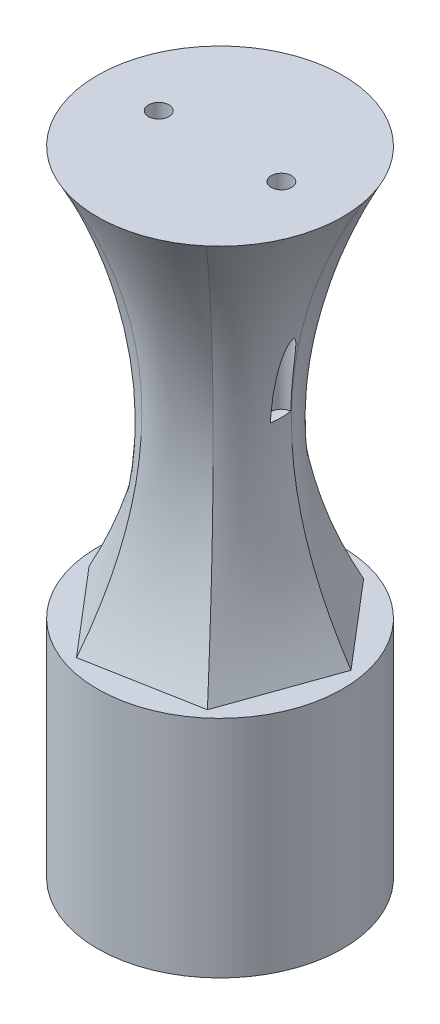
ISO-10303-21;
HEADER;
FILE_DESCRIPTION(('STEP AP214'),'2;1');
FILE_NAME('part.step','',(''),(''),'','','');
FILE_SCHEMA(('AUTOMOTIVE_DESIGN { 1 0 10303 214 1 1 1 1 }'));
ENDSEC;
DATA;
#1=APPLICATION_CONTEXT('core data for automotive mechanical design processes');
#2=APPLICATION_PROTOCOL_DEFINITION('international standard','automotive_design',2000,#1);
#3=PRODUCT_CONTEXT('',#1,'mechanical');
#4=PRODUCT('Part','Part','',(#3));
#5=PRODUCT_RELATED_PRODUCT_CATEGORY('part','',(#4));
#6=PRODUCT_DEFINITION_FORMATION('','',#4);
#7=PRODUCT_DEFINITION_CONTEXT('part definition',#1,'design');
#8=PRODUCT_DEFINITION('design','',#6,#7);
#9=PRODUCT_DEFINITION_SHAPE('','',#8);
#10=(LENGTH_UNIT() NAMED_UNIT(*) SI_UNIT(.MILLI.,.METRE.));
#11=(NAMED_UNIT(*) PLANE_ANGLE_UNIT() SI_UNIT($,.RADIAN.));
#12=(NAMED_UNIT(*) SI_UNIT($,.STERADIAN.) SOLID_ANGLE_UNIT());
#13=UNCERTAINTY_MEASURE_WITH_UNIT(LENGTH_MEASURE(1.E-05),#10,'distance_accuracy_value','');
#14=(GEOMETRIC_REPRESENTATION_CONTEXT(3) GLOBAL_UNCERTAINTY_ASSIGNED_CONTEXT((#13)) GLOBAL_UNIT_ASSIGNED_CONTEXT((#10,
#11,#12)) REPRESENTATION_CONTEXT('',''));
#15=CARTESIAN_POINT('',(0.,0.,0.));
#16=DIRECTION('',(0.,0.,1.));
#17=DIRECTION('',(1.,0.,0.));
#18=AXIS2_PLACEMENT_3D('',#15,#16,#17);
#19=CARTESIAN_POINT('',(0.,11.,0.));
#20=DIRECTION('',(0.,1.,0.));
#21=DIRECTION('',(0.,0.,1.));
#22=AXIS2_PLACEMENT_3D('',#19,#20,#21);
#23=PLANE('',#22);
#24=CARTESIAN_POINT('',(0.,11.,0.));
#25=DIRECTION('',(0.,1.,0.));
#26=DIRECTION('',(0.,0.,1.));
#27=AXIS2_PLACEMENT_3D('',#24,#25,#26);
#28=CIRCLE('',#27,6.);
#29=CARTESIAN_POINT('',(0.,11.,6.));
#30=VERTEX_POINT('',#29);
#31=EDGE_CURVE('E149',#30,#30,#28,.T.);
#32=ORIENTED_EDGE('',*,*,#31,.T.);
#33=EDGE_LOOP('',(#32));
#34=FACE_BOUND('',#33,.T.);
#35=DIRECTION('',(0.983408971364955,0.,-0.181402301636231));
#36=VECTOR('',#35,1.);
#37=CARTESIAN_POINT('',(-1.84033016288293,11.,5.18297066281329));
#38=LINE('',#37,#36);
#39=CARTESIAN_POINT('',(-1.84033016288293,11.,5.18297066281329));
#40=VERTEX_POINT('',#39);
#41=CARTESIAN_POINT('',(3.56841917962431,11.,4.18525800381402));
#42=VERTEX_POINT('',#41);
#43=EDGE_CURVE('E351',#40,#42,#38,.T.);
#44=ORIENTED_EDGE('',*,*,#43,.F.);
#45=DIRECTION('',(0.648803487204421,0.,0.760956000693459));
#46=VECTOR('',#45,1.);
#47=CARTESIAN_POINT('',(-5.40874934250725,11.,0.997712658999271));
#48=LINE('',#47,#46);
#49=CARTESIAN_POINT('',(-5.40874934250725,11.,0.997712658999271));
#50=VERTEX_POINT('',#49);
#51=EDGE_CURVE('E349',#50,#40,#48,.T.);
#52=ORIENTED_EDGE('',*,*,#51,.F.);
#53=DIRECTION('',(-0.334605484160533,0.,0.94235830232969));
#54=VECTOR('',#53,1.);
#55=CARTESIAN_POINT('',(-3.56841917962431,11.,-4.18525800381402));
#56=LINE('',#55,#54);
#57=CARTESIAN_POINT('',(-3.56841917962431,11.,-4.18525800381402));
#58=VERTEX_POINT('',#57);
#59=EDGE_CURVE('E298',#58,#50,#56,.T.);
#60=ORIENTED_EDGE('',*,*,#59,.F.);
#61=DIRECTION('',(-0.983408971364955,0.,0.181402301636231));
#62=VECTOR('',#61,1.);
#63=CARTESIAN_POINT('',(1.84033016288293,11.,-5.18297066281329));
#64=LINE('',#63,#62);
#65=CARTESIAN_POINT('',(1.84033016288293,11.,-5.18297066281329));
#66=VERTEX_POINT('',#65);
#67=EDGE_CURVE('E365',#66,#58,#64,.T.);
#68=ORIENTED_EDGE('',*,*,#67,.F.);
#69=DIRECTION('',(-0.648803487204421,0.,-0.760956000693459));
#70=VECTOR('',#69,1.);
#71=CARTESIAN_POINT('',(5.40874934250725,11.,-0.997712658999272));
#72=LINE('',#71,#70);
#73=CARTESIAN_POINT('',(5.40874934250725,11.,-0.997712658999272));
#74=VERTEX_POINT('',#73);
#75=EDGE_CURVE('E369',#74,#66,#72,.T.);
#76=ORIENTED_EDGE('',*,*,#75,.F.);
#77=DIRECTION('',(0.334605484160533,0.,-0.94235830232969));
#78=VECTOR('',#77,1.);
#79=CARTESIAN_POINT('',(3.56841917962431,11.,4.18525800381402));
#80=LINE('',#79,#78);
#81=EDGE_CURVE('E355',#42,#74,#80,.T.);
#82=ORIENTED_EDGE('',*,*,#81,.F.);
#83=EDGE_LOOP('',(#44,#52,#60,#68,#76,#82));
#84=FACE_BOUND('',#83,.T.);
#85=ADVANCED_FACE('F76',(#34,#84),#23,.T.);
#86=CARTESIAN_POINT('',(0.,11.,0.));
#87=DIRECTION('',(0.,-1.,0.));
#88=DIRECTION('',(0.,0.,-1.));
#89=AXIS2_PLACEMENT_3D('',#86,#87,#88);
#90=CYLINDRICAL_SURFACE('',#89,6.);
#91=ORIENTED_EDGE('',*,*,#31,.F.);
#92=EDGE_LOOP('',(#91));
#93=FACE_BOUND('',#92,.T.);
#94=CARTESIAN_POINT('',(0.,0.,0.));
#95=DIRECTION('',(0.,1.,0.));
#96=DIRECTION('',(0.,0.,1.));
#97=AXIS2_PLACEMENT_3D('',#94,#95,#96);
#98=CIRCLE('',#97,6.);
#99=CARTESIAN_POINT('',(0.,0.,6.));
#100=VERTEX_POINT('',#99);
#101=EDGE_CURVE('E359',#100,#100,#98,.T.);
#102=ORIENTED_EDGE('',*,*,#101,.T.);
#103=EDGE_LOOP('',(#102));
#104=FACE_BOUND('',#103,.T.);
#105=ADVANCED_FACE('F78',(#93,#104),#90,.T.);
#106=CARTESIAN_POINT('',(0.,0.,0.));
#107=DIRECTION('',(0.,1.,0.));
#108=DIRECTION('',(0.,0.,1.));
#109=AXIS2_PLACEMENT_3D('',#106,#107,#108);
#110=PLANE('',#109);
#111=CARTESIAN_POINT('',(0.,0.,0.));
#112=DIRECTION('',(0.,-1.,0.));
#113=DIRECTION('',(0.,0.,-1.));
#114=AXIS2_PLACEMENT_3D('',#111,#112,#113);
#115=CIRCLE('',#114,3.25);
#116=CARTESIAN_POINT('',(0.,0.,-3.25));
#117=VERTEX_POINT('',#116);
#118=EDGE_CURVE('E462',#117,#117,#115,.T.);
#119=ORIENTED_EDGE('',*,*,#118,.F.);
#120=EDGE_LOOP('',(#119));
#121=FACE_BOUND('',#120,.T.);
#122=ORIENTED_EDGE('',*,*,#101,.F.);
#123=EDGE_LOOP('',(#122));
#124=FACE_BOUND('',#123,.T.);
#125=ADVANCED_FACE('F477',(#121,#124),#110,.F.);
#126=CARTESIAN_POINT('',(0.,10.,0.));
#127=DIRECTION('',(0.,-1.,0.));
#128=DIRECTION('',(0.,0.,-1.));
#129=AXIS2_PLACEMENT_3D('',#126,#127,#128);
#130=CYLINDRICAL_SURFACE('',#129,3.25);
#131=CARTESIAN_POINT('',(0.,10.,0.));
#132=DIRECTION('',(0.,-1.,0.));
#133=DIRECTION('',(0.,0.,-1.));
#134=AXIS2_PLACEMENT_3D('',#131,#132,#133);
#135=CIRCLE('',#134,3.25);
#136=CARTESIAN_POINT('',(0.,10.,-3.25));
#137=VERTEX_POINT('',#136);
#138=EDGE_CURVE('E464',#137,#137,#135,.T.);
#139=ORIENTED_EDGE('',*,*,#138,.F.);
#140=EDGE_LOOP('',(#139));
#141=FACE_BOUND('',#140,.T.);
#142=ORIENTED_EDGE('',*,*,#118,.T.);
#143=EDGE_LOOP('',(#142));
#144=FACE_BOUND('',#143,.T.);
#145=ADVANCED_FACE('F479',(#141,#144),#130,.F.);
#146=CARTESIAN_POINT('',(0.,10.,0.));
#147=DIRECTION('',(0.,-1.,0.));
#148=DIRECTION('',(0.,0.,-1.));
#149=AXIS2_PLACEMENT_3D('',#146,#147,#148);
#150=PLANE('',#149);
#151=ORIENTED_EDGE('',*,*,#138,.T.);
#152=EDGE_LOOP('',(#151));
#153=FACE_BOUND('',#152,.T.);
#154=ADVANCED_FACE('F437',(#153),#150,.T.);
#155=CARTESIAN_POINT('',(0.,31.,0.));
#156=DIRECTION('',(0.,1.,0.));
#157=DIRECTION('',(0.,0.,1.));
#158=AXIS2_PLACEMENT_3D('',#155,#156,#157);
#159=PLANE('',#158);
#160=CARTESIAN_POINT('',(-3.,31.,0.));
#161=DIRECTION('',(0.,1.,0.));
#162=DIRECTION('',(0.,0.,1.));
#163=AXIS2_PLACEMENT_3D('',#160,#161,#162);
#164=CIRCLE('',#163,0.5);
#165=CARTESIAN_POINT('',(-3.,31.,0.499999999999999));
#166=VERTEX_POINT('',#165);
#167=EDGE_CURVE('E346',#166,#166,#164,.T.);
#168=ORIENTED_EDGE('',*,*,#167,.F.);
#169=EDGE_LOOP('',(#168));
#170=FACE_BOUND('',#169,.T.);
#171=CARTESIAN_POINT('',(3.,31.,0.));
#172=DIRECTION('',(0.,1.,0.));
#173=DIRECTION('',(0.,0.,1.));
#174=AXIS2_PLACEMENT_3D('',#171,#172,#173);
#175=CIRCLE('',#174,0.5);
#176=CARTESIAN_POINT('',(3.,31.,0.499999999999998));
#177=VERTEX_POINT('',#176);
#178=EDGE_CURVE('E154',#177,#177,#175,.T.);
#179=ORIENTED_EDGE('',*,*,#178,.F.);
#180=EDGE_LOOP('',(#179));
#181=FACE_BOUND('',#180,.T.);
#182=CARTESIAN_POINT('',(0.,31.,0.));
#183=DIRECTION('',(0.,1.,0.));
#184=DIRECTION('',(0.,0.,1.));
#185=AXIS2_PLACEMENT_3D('',#182,#183,#184);
#186=CIRCLE('',#185,6.);
#187=CARTESIAN_POINT('',(5.90045382818973,31.,-1.08841380981739));
#188=VERTEX_POINT('',#187);
#189=CARTESIAN_POINT('',(2.0076329049632,31.,-5.65414981397814));
#190=VERTEX_POINT('',#189);
#191=EDGE_CURVE('E223',#188,#190,#186,.T.);
#192=ORIENTED_EDGE('',*,*,#191,.T.);
#193=CARTESIAN_POINT('',(-3.89282092322652,31.,-4.56573600416075));
#194=VERTEX_POINT('',#193);
#195=EDGE_CURVE('E390',#190,#194,#186,.T.);
#196=ORIENTED_EDGE('',*,*,#195,.T.);
#197=CARTESIAN_POINT('',(-5.90045382818973,31.,1.08841380981739));
#198=VERTEX_POINT('',#197);
#199=EDGE_CURVE('E386',#194,#198,#186,.T.);
#200=ORIENTED_EDGE('',*,*,#199,.T.);
#201=CARTESIAN_POINT('',(-2.0076329049632,31.,5.65414981397814));
#202=VERTEX_POINT('',#201);
#203=EDGE_CURVE('E272',#198,#202,#186,.T.);
#204=ORIENTED_EDGE('',*,*,#203,.T.);
#205=CARTESIAN_POINT('',(3.89282092322652,31.,4.56573600416075));
#206=VERTEX_POINT('',#205);
#207=EDGE_CURVE('E422',#202,#206,#186,.T.);
#208=ORIENTED_EDGE('',*,*,#207,.T.);
#209=EDGE_CURVE('E285',#206,#188,#186,.T.);
#210=ORIENTED_EDGE('',*,*,#209,.T.);
#211=EDGE_LOOP('',(#192,#196,#200,#204,#208,#210));
#212=FACE_BOUND('',#211,.T.);
#213=ADVANCED_FACE('F195',(#170,#181,#212),#159,.T.);
#214=CARTESIAN_POINT('',(1.84033016288293,11.,-5.18297066281329));
#215=CARTESIAN_POINT('',(1.25496214692231,14.3562356860296,-3.53438318929149));
#216=CARTESIAN_POINT('',(0.697969680686137,21.1121104662841,-1.96571052927938));
#217=CARTESIAN_POINT('',(1.36649730830915,27.6895690193629,-3.84850262340139));
#218=CARTESIAN_POINT('',(2.0076329049632,31.,-5.65414981397814));
#219=CARTESIAN_POINT('',(0.0374137153805157,11.,-4.8503997764802));
#220=CARTESIAN_POINT('',(0.025513246223558,14.3562356860296,-3.30759569108377));
#221=CARTESIAN_POINT('',(-0.0128063931848519,21.1121104662841,-2.39049361333996));
#222=CARTESIAN_POINT('',(-0.0251395648643073,27.6895690193629,-4.68151735437799));
#223=CARTESIAN_POINT('',(-0.0121053467564245,31.,-6.37130325118291));
#224=CARTESIAN_POINT('',(-1.7655027321219,11.,-4.51782889014711));
#225=CARTESIAN_POINT('',(-1.20393565447519,14.3562356860296,-3.08080819287605));
#226=CARTESIAN_POINT('',(-0.840929426599453,21.1121104662841,-2.23773577944418));
#227=CARTESIAN_POINT('',(-1.64681154189777,27.6895690193629,-4.38237931750963));
#228=CARTESIAN_POINT('',(-2.26187870233605,31.,-5.95630392054273));
#229=CARTESIAN_POINT('',(-3.56841917962432,11.,-4.18525800381402));
#230=CARTESIAN_POINT('',(-2.43338455517394,14.3562356860296,-2.85402069466833));
#231=CARTESIAN_POINT('',(-1.35337041449943,21.1121104662841,-1.5873147391852));
#232=CARTESIAN_POINT('',(-2.64965238424208,27.6895690193629,-3.10767269489948));
#233=CARTESIAN_POINT('',(-3.89282092322652,31.,-4.56573600416075));
#234=B_SPLINE_SURFACE_WITH_KNOTS('',3,3,((#214,#215,#216,#217,#218),(#219,#220,#221,#222,#223),
(#224,#225,#226,#227,#228),(#229,#230,#231,#232,#233)),.UNSPECIFIED.,.F.,.F.,.F.,(4,4),(4,1,4),
(0.,1.),(0.,0.494937362252857,1.),.UNSPECIFIED.);
#235=CARTESIAN_POINT('',(-3.56841917962432,11.,-4.18525800381402));
#236=CARTESIAN_POINT('',(-2.43338455517394,14.3562356860296,-2.85402069466833));
#237=CARTESIAN_POINT('',(-1.35337041449943,21.1121104662841,-1.5873147391852));
#238=CARTESIAN_POINT('',(-2.64965238424208,27.6895690193629,-3.10767269489948));
#239=CARTESIAN_POINT('',(-3.89282092322652,31.,-4.56573600416075));
#240=B_SPLINE_CURVE_WITH_KNOTS('',3,(#235,#236,#237,#238,#239),.UNSPECIFIED.,.F.,.F.,(4,1,4),
(0.,0.494937362252857,1.),.UNSPECIFIED.);
#241=EDGE_CURVE('E297',#58,#194,#240,.T.);
#242=CARTESIAN_POINT('',(1.84033016288293,11.,-5.18297066281329));
#243=CARTESIAN_POINT('',(1.25496214692231,14.3562356860296,-3.53438318929149));
#244=CARTESIAN_POINT('',(0.697969680686137,21.1121104662841,-1.96571052927938));
#245=CARTESIAN_POINT('',(1.36649730830915,27.6895690193629,-3.84850262340139));
#246=CARTESIAN_POINT('',(2.0076329049632,31.,-5.65414981397814));
#247=B_SPLINE_CURVE_WITH_KNOTS('',3,(#242,#243,#244,#245,#246),.UNSPECIFIED.,.F.,.F.,(4,1,4),
(0.,0.494937362252857,1.),.UNSPECIFIED.);
#248=EDGE_CURVE('E291',#190,#66,#247,.F.);
#249=ORIENTED_EDGE('',*,*,#67,.T.);
#250=ORIENTED_EDGE('',*,*,#241,.T.);
#251=ORIENTED_EDGE('',*,*,#195,.F.);
#252=ORIENTED_EDGE('',*,*,#248,.T.);
#253=EDGE_LOOP('',(#249,#250,#251,#252));
#254=FACE_BOUND('',#253,.T.);
#255=ADVANCED_FACE('F189',(#254),#234,.T.);
#256=CARTESIAN_POINT('',(-3.56841917962431,11.,-4.18525800381402));
#257=CARTESIAN_POINT('',(-2.43338455517394,14.3562356860296,-2.85402069466833));
#258=CARTESIAN_POINT('',(-1.35337041449943,21.1121104662841,-1.5873147391852));
#259=CARTESIAN_POINT('',(-2.64965238424208,27.6895690193629,-3.10767269489948));
#260=CARTESIAN_POINT('',(-3.89282092322652,31.,-4.56573600416075));
#261=CARTESIAN_POINT('',(-4.18186256725196,11.,-2.45760111620959));
#262=CARTESIAN_POINT('',(-2.85170527081471,14.3562356860296,-1.67589296490449));
#263=CARTESIAN_POINT('',(-2.07663139332929,21.1121104662841,-1.18415614484105));
#264=CARTESIAN_POINT('',(-4.06688273958121,27.6895690193629,-2.31898717537642));
#265=CARTESIAN_POINT('',(-5.523763144117,31.,-3.17516808777878));
#266=CARTESIAN_POINT('',(-4.7953059548796,11.,-0.729944228605161));
#267=CARTESIAN_POINT('',(-3.27002598645548,14.3562356860296,-0.497765235140664));
#268=CARTESIAN_POINT('',(-2.35840074525576,21.1121104662841,-0.390601643497081));
#269=CARTESIAN_POINT('',(-4.61865758893173,27.6895690193629,-0.765009028225924));
#270=CARTESIAN_POINT('',(-6.28924985901888,31.,-1.01930754376936));
#271=CARTESIAN_POINT('',(-5.40874934250725,11.,0.997712658999271));
#272=CARTESIAN_POINT('',(-3.68834670209625,14.3562356860296,0.680362494623166));
#273=CARTESIAN_POINT('',(-2.05134009518556,21.1121104662841,0.378395790094181));
#274=CARTESIAN_POINT('',(-4.01614969255124,27.6895690193629,0.740829928501912));
#275=CARTESIAN_POINT('',(-5.90045382818973,31.,1.08841380981739));
#276=B_SPLINE_SURFACE_WITH_KNOTS('',3,3,((#256,#257,#258,#259,#260),(#261,#262,#263,#264,#265),
(#266,#267,#268,#269,#270),(#271,#272,#273,#274,#275)),.UNSPECIFIED.,.F.,.F.,.F.,(4,4),(4,1,4),
(0.,1.),(0.,0.494937362252857,1.),.UNSPECIFIED.);
#277=CARTESIAN_POINT('',(-2.95833464069776,21.0000000000001,0.498260973628036));
#278=CARTESIAN_POINT('',(-2.96044193076234,21.0832923525403,0.498434427180247));
#279=CARTESIAN_POINT('',(-2.96311866222239,21.1665687293552,0.498648257217201));
#280=CARTESIAN_POINT('',(-2.96963046959226,21.3330778352157,0.499087840527117));
#281=CARTESIAN_POINT('',(-2.97346556951439,21.4163105633205,0.499313594047167));
#282=CARTESIAN_POINT('',(-2.98674953235162,21.6661477914544,0.499906014352937));
#283=CARTESIAN_POINT('',(-2.99797141326797,21.8326637721194,0.500186990918346));
#284=CARTESIAN_POINT('',(-3.02080063736665,22.1093241694634,0.499648377404974));
#285=CARTESIAN_POINT('',(-3.03100814305823,22.2195864925019,0.499167249301472));
#286=CARTESIAN_POINT('',(-3.0537495766716,22.4398611561916,0.497234340862723));
#287=CARTESIAN_POINT('',(-3.06628340872082,22.5498735069557,0.495782600521933));
#288=CARTESIAN_POINT('',(-3.09382958433316,22.7695082421097,0.491316091932521));
#289=CARTESIAN_POINT('',(-3.10884074980416,22.8791307866794,0.48830206517526));
#290=CARTESIAN_POINT('',(-3.14154596425992,23.0978642376619,0.479843839829868));
#291=CARTESIAN_POINT('',(-3.15923948025302,23.2069752412888,0.474400123611986));
#292=CARTESIAN_POINT('',(-3.19758685069228,23.4245465309331,0.459770622092599));
#293=CARTESIAN_POINT('',(-3.2182429431027,23.5330062598483,0.45058199809258));
#294=CARTESIAN_POINT('',(-3.25169300134978,23.6947162052038,0.432214067158768));
#295=CARTESIAN_POINT('',(-3.2632589186496,23.7484766837421,0.425323733157928));
#296=CARTESIAN_POINT('',(-3.28725857514664,23.8554891038398,0.409499893941286));
#297=CARTESIAN_POINT('',(-3.29969204993394,23.9087411947668,0.400567009370444));
#298=CARTESIAN_POINT('',(-3.3255183941395,24.0146420615938,0.379889217000368));
#299=CARTESIAN_POINT('',(-3.33891363550034,24.0672889465796,0.368137177066569));
#300=CARTESIAN_POINT('',(-3.35971353115454,24.1451793669366,0.347418710752828));
#301=CARTESIAN_POINT('',(-3.36675556998339,24.1709318267366,0.340008498587682));
#302=CARTESIAN_POINT('',(-3.38107817756378,24.2219509619337,0.323877549787298));
#303=CARTESIAN_POINT('',(-3.3883586425191,24.2472178413168,0.315157377650863));
#304=CARTESIAN_POINT('',(-3.40178089358084,24.2924279618961,0.297773771486304));
#305=CARTESIAN_POINT('',(-3.407884289392,24.3124916485534,0.289398027794564));
#306=CARTESIAN_POINT('',(-3.42024152451668,24.3519708096687,0.271144244820909));
#307=CARTESIAN_POINT('',(-3.42649579233167,24.371383937123,0.261261358814091));
#308=CARTESIAN_POINT('',(-3.43916264345844,24.4093109779721,0.239373776444956));
#309=CARTESIAN_POINT('',(-3.44557622524228,24.4278114147291,0.227345192791134));
#310=CARTESIAN_POINT('',(-3.45511176719966,24.4539044405246,0.207188375567933));
#311=CARTESIAN_POINT('',(-3.45826788335558,24.4623057373787,0.200138584381193));
#312=CARTESIAN_POINT('',(-3.46450810528997,24.4783448432631,0.18519824857424));
#313=CARTESIAN_POINT('',(-3.46759220804592,24.4859826202912,0.177307668741709));
#314=CARTESIAN_POINT('',(-3.47542628483084,24.5044287366178,0.155474125579467));
#315=CARTESIAN_POINT('',(-3.48007676650074,24.5144230333668,0.140721519715236));
#316=CARTESIAN_POINT('',(-3.48631338502039,24.5256555490864,0.116489757658694));
#317=CARTESIAN_POINT('',(-3.48828048615579,24.5287817976468,0.107993120208232));
#318=CARTESIAN_POINT('',(-3.49182489124534,24.5333729861118,0.0904847152946751));
#319=CARTESIAN_POINT('',(-3.49340298294355,24.534841305289,0.0814740351280652));
#320=CARTESIAN_POINT('',(-3.49592976433828,24.5358653058499,0.0642022596597491));
#321=CARTESIAN_POINT('',(-3.4969262851813,24.5356010655896,0.0559586333919809));
#322=CARTESIAN_POINT('',(-3.49849702127319,24.5336258923369,0.0396051756530414));
#323=CARTESIAN_POINT('',(-3.49907084670957,24.5319136270837,0.0314954744077995));
#324=CARTESIAN_POINT('',(-3.50033632269014,24.5239763471103,0.00462834511104902));
#325=CARTESIAN_POINT('',(-3.5000869095636,24.5147862451528,-0.0132916291990151));
#326=CARTESIAN_POINT('',(-3.49830858888631,24.4944653160943,-0.0433802978658819));
#327=CARTESIAN_POINT('',(-3.4969991217201,24.4839105203049,-0.0560098766567922));
#328=CARTESIAN_POINT('',(-3.49374916219537,24.4612020825209,-0.0797024057382475));
#329=CARTESIAN_POINT('',(-3.49180684803495,24.4490438856301,-0.0907606991168029));
#330=CARTESIAN_POINT('',(-3.48671636743051,24.4190873393636,-0.11541583827956));
#331=CARTESIAN_POINT('',(-3.48338771262656,24.4008633000629,-0.128443610354871));
#332=CARTESIAN_POINT('',(-3.47626914306302,24.3633414835742,-0.152730204011054));
#333=CARTESIAN_POINT('',(-3.47247838147312,24.3440417713793,-0.163985688643044));
#334=CARTESIAN_POINT('',(-3.46458651295028,24.3046659855616,-0.185169558739739));
#335=CARTESIAN_POINT('',(-3.46048391490113,24.2845864396581,-0.195090846322683));
#336=CARTESIAN_POINT('',(-3.45209323446627,24.2439800538838,-0.213813723893126));
#337=CARTESIAN_POINT('',(-3.44780532768942,24.2234536462592,-0.222616344109786));
#338=CARTESIAN_POINT('',(-3.4358355630015,24.1664915780291,-0.245604229173913));
#339=CARTESIAN_POINT('',(-3.42802763611605,24.1297065552954,-0.258855844684915));
#340=CARTESIAN_POINT('',(-3.41225202764356,24.0554851229118,-0.283297347383969));
#341=CARTESIAN_POINT('',(-3.40428425313897,24.0180483361749,-0.294485994483131));
#342=CARTESIAN_POINT('',(-3.3803025840465,23.9049405810654,-0.325678532814742));
#343=CARTESIAN_POINT('',(-3.36424072238734,23.8286133053647,-0.34325683685816));
#344=CARTESIAN_POINT('',(-3.33249848441551,23.6749480970671,-0.374067676368896));
#345=CARTESIAN_POINT('',(-3.31681864488351,23.5976089534212,-0.387294390584951));
#346=CARTESIAN_POINT('',(-3.28611372388421,23.4424229010396,-0.410497913118984));
#347=CARTESIAN_POINT('',(-3.27108786569006,23.3645767283126,-0.420478673211294));
#348=CARTESIAN_POINT('',(-3.23965380604636,23.1969866259774,-0.439259198876275));
#349=CARTESIAN_POINT('',(-3.2233674550464,23.1071772118709,-0.447669194509276));
#350=CARTESIAN_POINT('',(-3.19192111414714,22.9271599379308,-0.462020534885988));
#351=CARTESIAN_POINT('',(-3.17676127091707,22.8369520278279,-0.467961558635));
#352=CARTESIAN_POINT('',(-3.13305091895208,22.5657473024938,-0.482965986246241));
#353=CARTESIAN_POINT('',(-3.10629506716824,22.3843044087725,-0.489197566929915));
#354=CARTESIAN_POINT('',(-3.05782125304284,22.021014188813,-0.497243442340968));
#355=CARTESIAN_POINT('',(-3.03609435508081,21.8391681686223,-0.499065627179972));
#356=CARTESIAN_POINT('',(-2.99763537370058,21.4750040664707,-0.500365363301612));
#357=CARTESIAN_POINT('',(-2.98090156687172,21.2926861693495,-0.499843724576813));
#358=CARTESIAN_POINT('',(-2.96376971888683,21.0734645258436,-0.49869309143781));
#359=CARTESIAN_POINT('',(-2.96100005584012,21.0367356046543,-0.498482687724506));
#360=CARTESIAN_POINT('',(-2.9583302958896,21.,-0.498260610282766));
#361=B_SPLINE_CURVE_WITH_KNOTS('',3,(#277,#278,#279,#280,#281,#282,#283,#284,#285,#286,#287,
#288,#289,#290,#291,#292,#293,#294,#295,#296,#297,#298,#299,#300,#301,#302,#303,#304,#305,#306,
#307,#308,#309,#310,#311,#312,#313,#314,#315,#316,#317,#318,#319,#320,#321,#322,#323,#324,#325,
#326,#327,#328,#329,#330,#331,#332,#333,#334,#335,#336,#337,#338,#339,#340,#341,#342,#343,#344,
#345,#346,#347,#348,#349,#350,#351,#352,#353,#354,#355,#356,#357,#358,#359,#360),.UNSPECIFIED.,
.F.,.F.,(4,2,2,2,2,2,2,2,2,2,2,2,2,2,2,2,2,2,2,2,2,2,2,2,2,2,2,2,2,2,2,2,2,2,2,2,2,2,2,2,2,4),
(0.,0.249952494666007,0.499910171061419,1.00050819881127,1.33268964081271,1.66485739599155,
1.99686764208709,2.3288120029411,2.66100845217354,2.82723427771123,2.99340966119579,
3.16000996694549,3.24310585848642,3.32616604383627,3.39386693587743,3.46179032210736,
3.53052333838362,3.56470898591569,3.59889606570941,3.65340459005576,3.68105968445883,
3.70865830856613,3.73343732656369,3.75823916742394,3.81745091123458,3.86682605235573,
3.91634460643034,3.98413631069999,4.05205416834316,4.12032014579065,4.18852279138868,
4.30804403158049,4.42763688564386,4.66728131304629,4.90724502864249,5.14691549809492,
5.42184602603331,5.69681228692375,6.24715809370363,6.7965183887477,7.34568884718011,
7.45618953981),.UNSPECIFIED.);
#362=CARTESIAN_POINT('',(-2.9583346406965,21.,0.498260973621363));
#363=VERTEX_POINT('',#362);
#364=CARTESIAN_POINT('',(-2.95833029588769,21.,-0.498260610294109));
#365=VERTEX_POINT('',#364);
#366=EDGE_CURVE('E12',#363,#365,#361,.T.);
#367=CARTESIAN_POINT('',(-2.95702037782887,21.,0.505999999999999));
#368=CARTESIAN_POINT('',(-2.9642143457108,21.,0.463975650883925));
#369=CARTESIAN_POINT('',(-2.97051355318742,21.,0.421798067175959));
#370=CARTESIAN_POINT('',(-2.98128173231578,21.,0.337439536219911));
#371=CARTESIAN_POINT('',(-2.98576032613242,21.,0.295259816956572));
#372=CARTESIAN_POINT('',(-2.99291102676122,21.,0.210899306448357));
#373=CARTESIAN_POINT('',(-2.99558953171907,21.,0.168719057640477));
#374=CARTESIAN_POINT('',(-2.99915652936356,21.,0.0843590431197224));
#375=CARTESIAN_POINT('',(-3.00004823683651,21.,0.042179413323957));
#376=CARTESIAN_POINT('',(-3.00004917160005,21.,-0.0421799540587648));
#377=CARTESIAN_POINT('',(-2.99915839526011,21.,-0.0843596916457657));
#378=CARTESIAN_POINT('',(-2.99559306202686,21.,-0.168719885807955));
#379=CARTESIAN_POINT('',(-2.9929152926338,21.,-0.210900206625885));
#380=CARTESIAN_POINT('',(-2.98576530101048,21.,-0.295260815033385));
#381=CARTESIAN_POINT('',(-2.98128667897632,21.,-0.337440560204439));
#382=CARTESIAN_POINT('',(-2.97051581425143,21.,-0.42179890216772));
#383=CARTESIAN_POINT('',(-2.96421392840295,21.,-0.463976267913623));
#384=CARTESIAN_POINT('',(-2.9570150295678,21.,-0.506000000000002));
#385=B_SPLINE_CURVE_WITH_KNOTS('',3,(#367,#368,#369,#370,#371,#372,#373,#374,#375,#376,#377,
#378,#379,#380,#381,#382,#383,#384),.UNSPECIFIED.,.F.,.F.,(4,2,2,2,2,2,2,2,4),(0.,
0.127897401782878,0.255109775974044,0.381867567099285,0.508397091493147,0.634926873599804,
0.761684734837903,0.88889710196445,1.01679498923665),.UNSPECIFIED.);
#386=EDGE_CURVE('E90',#363,#365,#385,.T.);
#387=CARTESIAN_POINT('',(-5.40874934250725,11.,0.997712658999271));
#388=CARTESIAN_POINT('',(-3.68834670209625,14.3562356860296,0.680362494623166));
#389=CARTESIAN_POINT('',(-2.05134009518556,21.1121104662841,0.378395790094181));
#390=CARTESIAN_POINT('',(-4.01614969255124,27.6895690193629,0.740829928501912));
#391=CARTESIAN_POINT('',(-5.90045382818973,31.,1.08841380981739));
#392=B_SPLINE_CURVE_WITH_KNOTS('',3,(#387,#388,#389,#390,#391),.UNSPECIFIED.,.F.,.F.,(4,1,4),
(0.,0.494937362252857,1.),.UNSPECIFIED.);
#393=EDGE_CURVE('E326',#50,#198,#392,.T.);
#394=ORIENTED_EDGE('',*,*,#366,.F.);
#395=ORIENTED_EDGE('',*,*,#386,.T.);
#396=EDGE_LOOP('',(#394,#395));
#397=FACE_BOUND('',#396,.T.);
#398=ORIENTED_EDGE('',*,*,#59,.T.);
#399=ORIENTED_EDGE('',*,*,#393,.T.);
#400=ORIENTED_EDGE('',*,*,#199,.F.);
#401=ORIENTED_EDGE('',*,*,#241,.F.);
#402=EDGE_LOOP('',(#398,#399,#400,#401));
#403=FACE_BOUND('',#402,.T.);
#404=ADVANCED_FACE('F194',(#397,#403),#276,.T.);
#405=CARTESIAN_POINT('',(5.40874934250725,11.,-0.997712658999272));
#406=CARTESIAN_POINT('',(3.68834670209625,14.3562356860296,-0.680362494623167));
#407=CARTESIAN_POINT('',(2.05134009518557,21.1121104662841,-0.37839579009418));
#408=CARTESIAN_POINT('',(4.01614969255124,27.6895690193629,-0.74082992850191));
#409=CARTESIAN_POINT('',(5.90045382818973,31.,-1.08841380981739));
#410=CARTESIAN_POINT('',(4.21927628263247,11.,-2.39279866027061));
#411=CARTESIAN_POINT('',(2.87721851703827,14.3562356860296,-1.63170272617927));
#412=CARTESIAN_POINT('',(2.06382500014444,21.1121104662841,-1.20633746849891));
#413=CARTESIAN_POINT('',(4.0417431747169,27.6895690193629,-2.36253017900157));
#414=CARTESIAN_POINT('',(5.51165779736058,31.,-3.19613516340414));
#415=CARTESIAN_POINT('',(3.0298032227577,11.,-3.78788466154195));
#416=CARTESIAN_POINT('',(2.06609033198029,14.3562356860296,-2.58304295773538));
#417=CARTESIAN_POINT('',(1.51747131865631,21.1121104662841,-1.8471341359471));
#418=CARTESIAN_POINT('',(2.97184604703396,27.6895690193629,-3.61737028928371));
#419=CARTESIAN_POINT('',(4.02737115668283,31.,-4.93699637677337));
#420=CARTESIAN_POINT('',(1.84033016288293,11.,-5.1829706628133));
#421=CARTESIAN_POINT('',(1.25496214692231,14.3562356860296,-3.53438318929149));
#422=CARTESIAN_POINT('',(0.697969680686138,21.1121104662841,-1.96571052927938));
#423=CARTESIAN_POINT('',(1.36649730830915,27.6895690193629,-3.84850262340139));
#424=CARTESIAN_POINT('',(2.0076329049632,31.,-5.65414981397814));
#425=B_SPLINE_SURFACE_WITH_KNOTS('',3,3,((#405,#406,#407,#408,#409),(#410,#411,#412,#413,#414),
(#415,#416,#417,#418,#419),(#420,#421,#422,#423,#424)),.UNSPECIFIED.,.F.,.F.,.F.,(4,4),(4,1,4),
(0.,1.),(0.,0.494937362252857,1.),.UNSPECIFIED.);
#426=CARTESIAN_POINT('',(5.40874934250725,11.,-0.997712658999272));
#427=CARTESIAN_POINT('',(3.68834670209625,14.3562356860296,-0.680362494623167));
#428=CARTESIAN_POINT('',(2.05134009518557,21.1121104662841,-0.378395790094179));
#429=CARTESIAN_POINT('',(4.01614969255124,27.6895690193629,-0.740829928501909));
#430=CARTESIAN_POINT('',(5.90045382818973,31.,-1.08841380981739));
#431=B_SPLINE_CURVE_WITH_KNOTS('',3,(#426,#427,#428,#429,#430),.UNSPECIFIED.,.F.,.F.,(4,1,4),
(0.,0.494937362252857,1.),.UNSPECIFIED.);
#432=EDGE_CURVE('E303',#74,#188,#431,.T.);
#433=ORIENTED_EDGE('',*,*,#75,.T.);
#434=ORIENTED_EDGE('',*,*,#248,.F.);
#435=ORIENTED_EDGE('',*,*,#191,.F.);
#436=ORIENTED_EDGE('',*,*,#432,.F.);
#437=EDGE_LOOP('',(#433,#434,#435,#436));
#438=FACE_BOUND('',#437,.T.);
#439=ADVANCED_FACE('F230',(#438),#425,.T.);
#440=CARTESIAN_POINT('',(-5.40874934250725,11.,0.997712658999271));
#441=CARTESIAN_POINT('',(-3.68834670209625,14.3562356860296,0.680362494623166));
#442=CARTESIAN_POINT('',(-2.05134009518556,21.1121104662841,0.378395790094181));
#443=CARTESIAN_POINT('',(-4.01614969255124,27.6895690193629,0.740829928501911));
#444=CARTESIAN_POINT('',(-5.90045382818973,31.,1.08841380981739));
#445=CARTESIAN_POINT('',(-4.21927628263248,11.,2.39279866027061));
#446=CARTESIAN_POINT('',(-2.87721851703827,14.3562356860296,1.63170272617927));
#447=CARTESIAN_POINT('',(-2.06382500014443,21.1121104662841,1.20633746849891));
#448=CARTESIAN_POINT('',(-4.0417431747169,27.6895690193629,2.36253017900157));
#449=CARTESIAN_POINT('',(-5.51165779736058,31.,3.19613516340414));
#450=CARTESIAN_POINT('',(-3.02980322275771,11.,3.78788466154195));
#451=CARTESIAN_POINT('',(-2.06609033198029,14.3562356860296,2.58304295773538));
#452=CARTESIAN_POINT('',(-1.5174713186563,21.1121104662841,1.8471341359471));
#453=CARTESIAN_POINT('',(-2.97184604703396,27.6895690193629,3.6173702892837));
#454=CARTESIAN_POINT('',(-4.02737115668283,31.,4.93699637677336));
#455=CARTESIAN_POINT('',(-1.84033016288293,11.,5.18297066281329));
#456=CARTESIAN_POINT('',(-1.25496214692231,14.3562356860296,3.53438318929149));
#457=CARTESIAN_POINT('',(-0.697969680686139,21.1121104662841,1.96571052927938));
#458=CARTESIAN_POINT('',(-1.36649730830916,27.6895690193629,3.84850262340139));
#459=CARTESIAN_POINT('',(-2.0076329049632,31.,5.65414981397814));
#460=B_SPLINE_SURFACE_WITH_KNOTS('',3,3,((#440,#441,#442,#443,#444),(#445,#446,#447,#448,#449),
(#450,#451,#452,#453,#454),(#455,#456,#457,#458,#459)),.UNSPECIFIED.,.F.,.F.,.F.,(4,4),(4,1,4),
(0.,1.),(0.,0.494937362252857,1.),.UNSPECIFIED.);
#461=CARTESIAN_POINT('',(-1.84033016288293,11.,5.18297066281329));
#462=CARTESIAN_POINT('',(-1.25496214692231,14.3562356860296,3.53438318929149));
#463=CARTESIAN_POINT('',(-0.697969680686139,21.1121104662841,1.96571052927938));
#464=CARTESIAN_POINT('',(-1.36649730830916,27.6895690193629,3.84850262340139));
#465=CARTESIAN_POINT('',(-2.0076329049632,31.,5.65414981397814));
#466=B_SPLINE_CURVE_WITH_KNOTS('',3,(#461,#462,#463,#464,#465),.UNSPECIFIED.,.F.,.F.,(4,1,4),
(0.,0.494937362252857,1.),.UNSPECIFIED.);
#467=EDGE_CURVE('E317',#40,#202,#466,.T.);
#468=ORIENTED_EDGE('',*,*,#51,.T.);
#469=ORIENTED_EDGE('',*,*,#467,.T.);
#470=ORIENTED_EDGE('',*,*,#203,.F.);
#471=ORIENTED_EDGE('',*,*,#393,.F.);
#472=EDGE_LOOP('',(#468,#469,#470,#471));
#473=FACE_BOUND('',#472,.T.);
#474=ADVANCED_FACE('F241',(#473),#460,.T.);
#475=CARTESIAN_POINT('',(-1.84033016288293,11.,5.18297066281329));
#476=CARTESIAN_POINT('',(-1.25496214692231,14.3562356860296,3.53438318929149));
#477=CARTESIAN_POINT('',(-0.697969680686139,21.1121104662841,1.96571052927938));
#478=CARTESIAN_POINT('',(-1.36649730830915,27.6895690193629,3.84850262340139));
#479=CARTESIAN_POINT('',(-2.0076329049632,31.,5.65414981397814));
#480=CARTESIAN_POINT('',(-0.0374137153805177,11.,4.8503997764802));
#481=CARTESIAN_POINT('',(-0.0255132462235593,14.3562356860296,3.30759569108377));
#482=CARTESIAN_POINT('',(0.0128063931848503,21.1121104662841,2.39049361333996));
#483=CARTESIAN_POINT('',(0.0251395648643049,27.6895690193629,4.68151735437799));
#484=CARTESIAN_POINT('',(0.012105346756421,31.,6.37130325118292));
#485=CARTESIAN_POINT('',(1.7655027321219,11.,4.51782889014711));
#486=CARTESIAN_POINT('',(1.20393565447519,14.3562356860296,3.08080819287605));
#487=CARTESIAN_POINT('',(0.840929426599452,21.1121104662841,2.23773577944418));
#488=CARTESIAN_POINT('',(1.64681154189777,27.6895690193629,4.38237931750963));
#489=CARTESIAN_POINT('',(2.26187870233605,31.,5.95630392054273));
#490=CARTESIAN_POINT('',(3.56841917962432,11.,4.18525800381402));
#491=CARTESIAN_POINT('',(2.43338455517394,14.3562356860296,2.85402069466833));
#492=CARTESIAN_POINT('',(1.35337041449943,21.1121104662841,1.5873147391852));
#493=CARTESIAN_POINT('',(2.64965238424208,27.6895690193629,3.10767269489948));
#494=CARTESIAN_POINT('',(3.89282092322652,31.,4.56573600416075));
#495=B_SPLINE_SURFACE_WITH_KNOTS('',3,3,((#475,#476,#477,#478,#479),(#480,#481,#482,#483,#484),
(#485,#486,#487,#488,#489),(#490,#491,#492,#493,#494)),.UNSPECIFIED.,.F.,.F.,.F.,(4,4),(4,1,4),
(0.,1.),(0.,0.494937362252857,1.),.UNSPECIFIED.);
#496=CARTESIAN_POINT('',(3.56841917962432,11.,4.18525800381402));
#497=CARTESIAN_POINT('',(2.43338455517394,14.3562356860296,2.85402069466833));
#498=CARTESIAN_POINT('',(1.35337041449943,21.1121104662841,1.5873147391852));
#499=CARTESIAN_POINT('',(2.64965238424208,27.6895690193629,3.10767269489948));
#500=CARTESIAN_POINT('',(3.89282092322652,31.,4.56573600416075));
#501=B_SPLINE_CURVE_WITH_KNOTS('',3,(#496,#497,#498,#499,#500),.UNSPECIFIED.,.F.,.F.,(4,1,4),
(0.,0.494937362252857,1.),.UNSPECIFIED.);
#502=EDGE_CURVE('E308',#42,#206,#501,.T.);
#503=ORIENTED_EDGE('',*,*,#43,.T.);
#504=ORIENTED_EDGE('',*,*,#502,.T.);
#505=ORIENTED_EDGE('',*,*,#207,.F.);
#506=ORIENTED_EDGE('',*,*,#467,.F.);
#507=EDGE_LOOP('',(#503,#504,#505,#506));
#508=FACE_BOUND('',#507,.T.);
#509=ADVANCED_FACE('F251',(#508),#495,.T.);
#510=CARTESIAN_POINT('',(3.56841917962431,11.,4.18525800381402));
#511=CARTESIAN_POINT('',(2.43338455517394,14.3562356860296,2.85402069466833));
#512=CARTESIAN_POINT('',(1.35337041449943,21.1121104662841,1.5873147391852));
#513=CARTESIAN_POINT('',(2.64965238424208,27.6895690193629,3.10767269489948));
#514=CARTESIAN_POINT('',(3.89282092322653,31.,4.56573600416075));
#515=CARTESIAN_POINT('',(4.18186256725196,11.,2.45760111620959));
#516=CARTESIAN_POINT('',(2.85170527081471,14.3562356860296,1.67589296490449));
#517=CARTESIAN_POINT('',(2.07663139332929,21.1121104662841,1.18415614484105));
#518=CARTESIAN_POINT('',(4.06688273958121,27.6895690193629,2.31898717537642));
#519=CARTESIAN_POINT('',(5.523763144117,31.,3.17516808777878));
#520=CARTESIAN_POINT('',(4.7953059548796,11.,0.729944228605159));
#521=CARTESIAN_POINT('',(3.27002598645548,14.3562356860296,0.497765235140664));
#522=CARTESIAN_POINT('',(2.35840074525576,21.1121104662841,0.390601643497083));
#523=CARTESIAN_POINT('',(4.61865758893173,27.6895690193629,0.765009028225927));
#524=CARTESIAN_POINT('',(6.28924985901888,31.,1.01930754376937));
#525=CARTESIAN_POINT('',(5.40874934250725,11.,-0.997712658999272));
#526=CARTESIAN_POINT('',(3.68834670209625,14.3562356860296,-0.680362494623167));
#527=CARTESIAN_POINT('',(2.05134009518557,21.1121104662841,-0.378395790094179));
#528=CARTESIAN_POINT('',(4.01614969255124,27.6895690193629,-0.740829928501909));
#529=CARTESIAN_POINT('',(5.90045382818973,31.,-1.08841380981739));
#530=B_SPLINE_SURFACE_WITH_KNOTS('',3,3,((#510,#511,#512,#513,#514),(#515,#516,#517,#518,#519),
(#520,#521,#522,#523,#524),(#525,#526,#527,#528,#529)),.UNSPECIFIED.,.F.,.F.,.F.,(4,4),(4,1,4),
(0.,1.),(0.,0.494937362252857,1.),.UNSPECIFIED.);
#531=CARTESIAN_POINT('',(2.9583346406965,21.,-0.498260973621366));
#532=CARTESIAN_POINT('',(2.96044193076187,21.0832923525401,-0.498434427177793));
#533=CARTESIAN_POINT('',(2.96311866222226,21.166568729355,-0.498648257216531));
#534=CARTESIAN_POINT('',(2.96963046959237,21.3330778352154,-0.499087840527792));
#535=CARTESIAN_POINT('',(2.97346556951442,21.4163105633203,-0.499313594047402));
#536=CARTESIAN_POINT('',(2.98674953235151,21.6661477914542,-0.499906014352473));
#537=CARTESIAN_POINT('',(2.99797141326794,21.8326637721191,-0.500186990918248));
#538=CARTESIAN_POINT('',(3.02080063736665,22.1093241694632,-0.499648377405044));
#539=CARTESIAN_POINT('',(3.03100814305822,22.2195864925017,-0.499167249301494));
#540=CARTESIAN_POINT('',(3.05374957667158,22.4398611561915,-0.49723434086271));
#541=CARTESIAN_POINT('',(3.06628340872081,22.5498735069556,-0.495782600521933));
#542=CARTESIAN_POINT('',(3.09382958433315,22.7695082421096,-0.49131609193253));
#543=CARTESIAN_POINT('',(3.10884074980416,22.8791307866794,-0.488302065175265));
#544=CARTESIAN_POINT('',(3.14154596425993,23.0978642376619,-0.479843839829869));
#545=CARTESIAN_POINT('',(3.15923948025303,23.2069752412889,-0.474400123611985));
#546=CARTESIAN_POINT('',(3.1975868506923,23.4245465309332,-0.459770622092593));
#547=CARTESIAN_POINT('',(3.21824294310273,23.5330062598484,-0.450581998092571));
#548=CARTESIAN_POINT('',(3.25169300134981,23.6947162052039,-0.43221406715875));
#549=CARTESIAN_POINT('',(3.26325891864964,23.7484766837423,-0.425323733157907));
#550=CARTESIAN_POINT('',(3.28725857514669,23.85548910384,-0.409499893941257));
#551=CARTESIAN_POINT('',(3.29969204993399,23.908741194767,-0.400567009370409));
#552=CARTESIAN_POINT('',(3.32551839413956,24.014642061594,-0.379889217000321));
#553=CARTESIAN_POINT('',(3.3389136355004,24.0672889465799,-0.368137177066514));
#554=CARTESIAN_POINT('',(3.35971353115461,24.1451793669368,-0.347418710752757));
#555=CARTESIAN_POINT('',(3.36675556998346,24.1709318267368,-0.340008498587605));
#556=CARTESIAN_POINT('',(3.38107817756386,24.221950961934,-0.323877549787208));
#557=CARTESIAN_POINT('',(3.38835864251918,24.2472178413171,-0.315157377650767));
#558=CARTESIAN_POINT('',(3.40178089358091,24.2924279618963,-0.297773771486213));
#559=CARTESIAN_POINT('',(3.40788428939205,24.3124916485536,-0.28939802779449));
#560=CARTESIAN_POINT('',(3.4202415245167,24.3519708096688,-0.27114424482088));
#561=CARTESIAN_POINT('',(3.42649579233167,24.371383937123,-0.261261358814091));
#562=CARTESIAN_POINT('',(3.43916264345841,24.409310977972,-0.239373776445021));
#563=CARTESIAN_POINT('',(3.44557622524222,24.427811414729,-0.227345192791238));
#564=CARTESIAN_POINT('',(3.45511176719957,24.4539044405244,-0.207188375568117));
#565=CARTESIAN_POINT('',(3.45826788335548,24.4623057373784,-0.200138584381408));
#566=CARTESIAN_POINT('',(3.46450810528986,24.4783448432628,-0.185198248574513));
#567=CARTESIAN_POINT('',(3.46759220804581,24.4859826202909,-0.177307668742012));
#568=CARTESIAN_POINT('',(3.47542628483073,24.5044287366175,-0.155474125579804));
#569=CARTESIAN_POINT('',(3.48007676650064,24.5144230333666,-0.140721519715576));
#570=CARTESIAN_POINT('',(3.48631338502031,24.5256555490862,-0.116489757659031));
#571=CARTESIAN_POINT('',(3.48828048615572,24.5287817976467,-0.107993120208566));
#572=CARTESIAN_POINT('',(3.49182489124527,24.5333729861117,-0.0904847152949981));
#573=CARTESIAN_POINT('',(3.49340298294349,24.534841305289,-0.0814740351283796));
#574=CARTESIAN_POINT('',(3.49592976433824,24.5358653058499,-0.0642022596600412));
#575=CARTESIAN_POINT('',(3.49692628518127,24.5356010655896,-0.0559586333922597));
#576=CARTESIAN_POINT('',(3.49849702127317,24.533625892337,-0.0396051756532906));
#577=CARTESIAN_POINT('',(3.49907084670956,24.5319136270837,-0.0314954744080324));
#578=CARTESIAN_POINT('',(3.50033632269013,24.5239763471104,-0.00462834511128844));
#579=CARTESIAN_POINT('',(3.50008690956361,24.5147862451529,0.0132916291987606));
#580=CARTESIAN_POINT('',(3.49830858888634,24.4944653160945,0.0433802978655877));
#581=CARTESIAN_POINT('',(3.49699912172013,24.4839105203051,0.056009876656475));
#582=CARTESIAN_POINT('',(3.49374916219543,24.4612020825212,0.079702405737895));
#583=CARTESIAN_POINT('',(3.49180684803502,24.4490438856305,0.0907606991164382));
#584=CARTESIAN_POINT('',(3.48671636743061,24.4190873393642,0.115415838279141));
#585=CARTESIAN_POINT('',(3.48338771262668,24.4008633000636,0.128443610354412));
#586=CARTESIAN_POINT('',(3.47626914306318,24.363341483575,0.152730204010534));
#587=CARTESIAN_POINT('',(3.47247838147331,24.3440417713802,0.163985688642503));
#588=CARTESIAN_POINT('',(3.46458651295051,24.3046659855627,0.185169558739154));
#589=CARTESIAN_POINT('',(3.46048391490139,24.2845864396594,0.195090846322075));
#590=CARTESIAN_POINT('',(3.45209323446657,24.2439800538852,0.213813723892481));
#591=CARTESIAN_POINT('',(3.44780532768974,24.2234536462607,0.222616344109128));
#592=CARTESIAN_POINT('',(3.4358355630019,24.166491578031,0.245604229173204));
#593=CARTESIAN_POINT('',(3.42802763611649,24.1297065552974,0.258855844684174));
#594=CARTESIAN_POINT('',(3.4122520276441,24.0554851229144,0.283297347383174));
#595=CARTESIAN_POINT('',(3.40428425313956,24.0180483361777,0.294485994482316));
#596=CARTESIAN_POINT('',(3.38030258404723,23.9049405810688,0.325678532813878));
#597=CARTESIAN_POINT('',(3.36424072238816,23.8286133053686,0.343256836857284));
#598=CARTESIAN_POINT('',(3.33249848441649,23.6749480970719,0.374067676368013));
#599=CARTESIAN_POINT('',(3.31681864488457,23.5976089534265,0.387294390584076));
#600=CARTESIAN_POINT('',(3.28611372388541,23.4424229010458,0.410497913118137));
#601=CARTESIAN_POINT('',(3.27108786569134,23.3645767283192,0.420478673210468));
#602=CARTESIAN_POINT('',(3.23965380604761,23.1969866259842,0.439259198875595));
#603=CARTESIAN_POINT('',(3.22336745504757,23.1071772118775,0.447669194508693));
#604=CARTESIAN_POINT('',(3.19192111414815,22.9271599379367,0.462020534885568));
#605=CARTESIAN_POINT('',(3.176761270918,22.8369520278335,0.467961558634646));
#606=CARTESIAN_POINT('',(3.1330509189528,22.5657473024986,0.48296598624605));
#607=CARTESIAN_POINT('',(3.10629506716882,22.3843044087767,0.489197566929789));
#608=CARTESIAN_POINT('',(3.0578212530432,22.0210141888159,0.497243442340928));
#609=CARTESIAN_POINT('',(3.03609435508108,21.8391681686246,0.499065627179953));
#610=CARTESIAN_POINT('',(2.99763537370068,21.4750040664718,0.500365363301612));
#611=CARTESIAN_POINT('',(2.98090156687176,21.29268616935,0.499843724576811));
#612=CARTESIAN_POINT('',(2.96376971888683,21.0734645258435,0.498693091437806));
#613=CARTESIAN_POINT('',(2.96100005584012,21.0367356046543,0.498482687724502));
#614=CARTESIAN_POINT('',(2.9583302958896,21.,0.498260610282762));
#615=B_SPLINE_CURVE_WITH_KNOTS('',3,(#531,#532,#533,#534,#535,#536,#537,#538,#539,#540,#541,
#542,#543,#544,#545,#546,#547,#548,#549,#550,#551,#552,#553,#554,#555,#556,#557,#558,#559,#560,
#561,#562,#563,#564,#565,#566,#567,#568,#569,#570,#571,#572,#573,#574,#575,#576,#577,#578,#579,
#580,#581,#582,#583,#584,#585,#586,#587,#588,#589,#590,#591,#592,#593,#594,#595,#596,#597,#598,
#599,#600,#601,#602,#603,#604,#605,#606,#607,#608,#609,#610,#611,#612,#613,#614),.UNSPECIFIED.,
.F.,.F.,(4,2,2,2,2,2,2,2,2,2,2,2,2,2,2,2,2,2,2,2,2,2,2,2,2,2,2,2,2,2,2,2,2,2,2,2,2,2,2,2,2,4),
(0.,0.24995249466599,0.499910171061396,1.00050819881126,1.33268964081276,1.66485739599168,
1.9968676420873,2.32881200294138,2.6610084521739,2.82723427771162,2.99340966119622,
3.16000996694595,3.24310585848691,3.32616604383678,3.39386693587775,3.46179032210749,
3.53052333838355,3.56470898591552,3.59889606570914,3.65340459005557,3.68105968445867,
3.70865830856601,3.73343732656361,3.75823916742391,3.81745091123445,3.86682605235545,
3.91634460642993,3.98413631069928,4.05205416834215,4.12032014578933,4.18852279138706,
4.30804403157819,4.42763688564087,4.66728131304193,4.90724502863677,5.14691549808783,
5.42184602602715,5.69681228691851,6.24715809370024,6.79651838874616,7.34568884718043,
7.45618953981018),.UNSPECIFIED.);
#616=CARTESIAN_POINT('',(2.9583346406965,21.,-0.498260973621366));
#617=VERTEX_POINT('',#616);
#618=CARTESIAN_POINT('',(2.95833029588769,21.,0.498260610294106));
#619=VERTEX_POINT('',#618);
#620=EDGE_CURVE('E148',#617,#619,#615,.T.);
#621=CARTESIAN_POINT('',(2.95702037782887,21.,-0.506000000000002));
#622=CARTESIAN_POINT('',(2.9642143457108,21.,-0.463975650883928));
#623=CARTESIAN_POINT('',(2.97051355318742,21.,-0.421798067175962));
#624=CARTESIAN_POINT('',(2.98128173231578,21.,-0.337439536219914));
#625=CARTESIAN_POINT('',(2.98576032613242,21.,-0.295259816956575));
#626=CARTESIAN_POINT('',(2.99291102676123,21.,-0.21089930644836));
#627=CARTESIAN_POINT('',(2.99558953171907,21.,-0.168719057640481));
#628=CARTESIAN_POINT('',(2.99915652936356,21.,-0.084359043119726));
#629=CARTESIAN_POINT('',(3.00004823683651,21.,-0.0421794133239606));
#630=CARTESIAN_POINT('',(3.00004917160005,21.,0.0421799540587611));
#631=CARTESIAN_POINT('',(2.99915839526011,21.,0.084359691645762));
#632=CARTESIAN_POINT('',(2.99559306202686,21.,0.168719885807951));
#633=CARTESIAN_POINT('',(2.9929152926338,21.,0.210900206625881));
#634=CARTESIAN_POINT('',(2.98576530101048,21.,0.295260815033381));
#635=CARTESIAN_POINT('',(2.98128667897632,21.,0.337440560204435));
#636=CARTESIAN_POINT('',(2.97051581425144,21.,0.421798902167716));
#637=CARTESIAN_POINT('',(2.96421392840295,21.,0.463976267913619));
#638=CARTESIAN_POINT('',(2.95701502956781,21.,0.505999999999998));
#639=B_SPLINE_CURVE_WITH_KNOTS('',3,(#621,#622,#623,#624,#625,#626,#627,#628,#629,#630,#631,
#632,#633,#634,#635,#636,#637,#638),.UNSPECIFIED.,.F.,.F.,(4,2,2,2,2,2,2,2,4),(0.,
0.127897401782878,0.255109775974044,0.381867567099285,0.508397091493147,0.634926873599803,
0.761684734837902,0.888897101964449,1.01679498923665),.UNSPECIFIED.);
#640=EDGE_CURVE('E144',#617,#619,#639,.T.);
#641=ORIENTED_EDGE('',*,*,#620,.F.);
#642=ORIENTED_EDGE('',*,*,#640,.T.);
#643=EDGE_LOOP('',(#641,#642));
#644=FACE_BOUND('',#643,.T.);
#645=ORIENTED_EDGE('',*,*,#81,.T.);
#646=ORIENTED_EDGE('',*,*,#432,.T.);
#647=ORIENTED_EDGE('',*,*,#209,.F.);
#648=ORIENTED_EDGE('',*,*,#502,.F.);
#649=EDGE_LOOP('',(#645,#646,#647,#648));
#650=FACE_BOUND('',#649,.T.);
#651=ADVANCED_FACE('F156',(#644,#650),#530,.T.);
#652=CARTESIAN_POINT('',(3.,21.,0.));
#653=DIRECTION('',(0.,1.,0.));
#654=DIRECTION('',(0.,0.,1.));
#655=AXIS2_PLACEMENT_3D('',#652,#653,#654);
#656=CYLINDRICAL_SURFACE('',#655,0.5);
#657=ORIENTED_EDGE('',*,*,#620,.T.);
#658=CARTESIAN_POINT('',(3.,21.,0.));
#659=DIRECTION('',(0.,1.,0.));
#660=DIRECTION('',(0.,0.,1.));
#661=AXIS2_PLACEMENT_3D('',#658,#659,#660);
#662=CIRCLE('',#661,0.5);
#663=EDGE_CURVE('E102',#617,#619,#662,.T.);
#664=ORIENTED_EDGE('',*,*,#663,.F.);
#665=EDGE_LOOP('',(#657,#664));
#666=FACE_BOUND('',#665,.T.);
#667=ORIENTED_EDGE('',*,*,#178,.T.);
#668=EDGE_LOOP('',(#667));
#669=FACE_BOUND('',#668,.T.);
#670=ADVANCED_FACE('F152',(#666,#669),#656,.F.);
#671=CARTESIAN_POINT('',(3.,21.,0.));
#672=DIRECTION('',(0.,1.,0.));
#673=DIRECTION('',(0.,0.,1.));
#674=AXIS2_PLACEMENT_3D('',#671,#672,#673);
#675=PLANE('',#674);
#676=ORIENTED_EDGE('',*,*,#663,.T.);
#677=ORIENTED_EDGE('',*,*,#640,.F.);
#678=EDGE_LOOP('',(#676,#677));
#679=FACE_BOUND('',#678,.T.);
#680=ADVANCED_FACE('F145',(#679),#675,.T.);
#681=CARTESIAN_POINT('',(-3.,21.,0.));
#682=DIRECTION('',(0.,1.,0.));
#683=DIRECTION('',(0.,0.,1.));
#684=AXIS2_PLACEMENT_3D('',#681,#682,#683);
#685=CYLINDRICAL_SURFACE('',#684,0.5);
#686=ORIENTED_EDGE('',*,*,#366,.T.);
#687=CARTESIAN_POINT('',(-3.,21.,0.));
#688=DIRECTION('',(0.,1.,0.));
#689=DIRECTION('',(0.,0.,1.));
#690=AXIS2_PLACEMENT_3D('',#687,#688,#689);
#691=CIRCLE('',#690,0.5);
#692=EDGE_CURVE('E96',#363,#365,#691,.T.);
#693=ORIENTED_EDGE('',*,*,#692,.F.);
#694=EDGE_LOOP('',(#686,#693));
#695=FACE_BOUND('',#694,.T.);
#696=ORIENTED_EDGE('',*,*,#167,.T.);
#697=EDGE_LOOP('',(#696));
#698=FACE_BOUND('',#697,.T.);
#699=ADVANCED_FACE('F184',(#695,#698),#685,.F.);
#700=CARTESIAN_POINT('',(-3.,21.,0.));
#701=DIRECTION('',(0.,1.,0.));
#702=DIRECTION('',(0.,0.,1.));
#703=AXIS2_PLACEMENT_3D('',#700,#701,#702);
#704=PLANE('',#703);
#705=ORIENTED_EDGE('',*,*,#692,.T.);
#706=ORIENTED_EDGE('',*,*,#386,.F.);
#707=EDGE_LOOP('',(#705,#706));
#708=FACE_BOUND('',#707,.T.);
#709=ADVANCED_FACE('F562',(#708),#704,.T.);
#710=CLOSED_SHELL('',(#85,#105,#125,#145,#154,#213,#255,#404,#439,#474,#509,#651,#670,#680,#699,#709));
#711=MANIFOLD_SOLID_BREP('B2',#710);
#712=ADVANCED_BREP_SHAPE_REPRESENTATION('',(#18,#711),#14);
#713=SHAPE_DEFINITION_REPRESENTATION(#9,#712);
ENDSEC;
END-ISO-10303-21;
